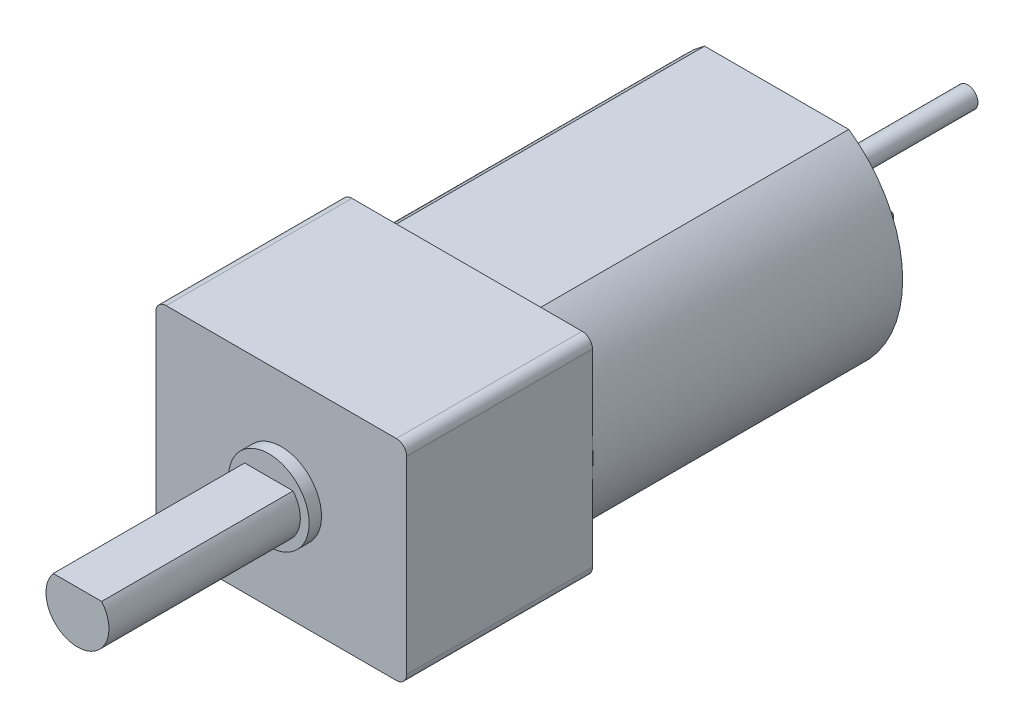
ISO-10303-21;
HEADER;
FILE_DESCRIPTION(('STEP AP214'),'2;1');
FILE_NAME('part.step','',(''),(''),'','','');
FILE_SCHEMA(('AUTOMOTIVE_DESIGN { 1 0 10303 214 1 1 1 1 }'));
ENDSEC;
DATA;
#1=APPLICATION_CONTEXT('core data for automotive mechanical design processes');
#2=APPLICATION_PROTOCOL_DEFINITION('international standard','automotive_design',2000,#1);
#3=PRODUCT_CONTEXT('',#1,'mechanical');
#4=PRODUCT('Part','Part','',(#3));
#5=PRODUCT_RELATED_PRODUCT_CATEGORY('part','',(#4));
#6=PRODUCT_DEFINITION_FORMATION('','',#4);
#7=PRODUCT_DEFINITION_CONTEXT('part definition',#1,'design');
#8=PRODUCT_DEFINITION('design','',#6,#7);
#9=PRODUCT_DEFINITION_SHAPE('','',#8);
#10=(LENGTH_UNIT() NAMED_UNIT(*) SI_UNIT(.MILLI.,.METRE.));
#11=(NAMED_UNIT(*) PLANE_ANGLE_UNIT() SI_UNIT($,.RADIAN.));
#12=(NAMED_UNIT(*) SI_UNIT($,.STERADIAN.) SOLID_ANGLE_UNIT());
#13=UNCERTAINTY_MEASURE_WITH_UNIT(LENGTH_MEASURE(1.E-05),#10,'distance_accuracy_value','');
#14=(GEOMETRIC_REPRESENTATION_CONTEXT(3) GLOBAL_UNCERTAINTY_ASSIGNED_CONTEXT((#13)) GLOBAL_UNIT_ASSIGNED_CONTEXT((#10,
#11,#12)) REPRESENTATION_CONTEXT('',''));
#15=CARTESIAN_POINT('',(0.,0.,0.));
#16=DIRECTION('',(0.,0.,1.));
#17=DIRECTION('',(1.,0.,0.));
#18=AXIS2_PLACEMENT_3D('',#15,#16,#17);
#19=CARTESIAN_POINT('',(0.,0.,-25.5));
#20=DIRECTION('',(0.,0.,-1.));
#21=DIRECTION('',(-1.,0.,0.));
#22=AXIS2_PLACEMENT_3D('',#19,#20,#21);
#23=PLANE('',#22);
#24=CARTESIAN_POINT('',(0.,0.,-25.5));
#25=DIRECTION('',(0.,0.,-1.));
#26=DIRECTION('',(-1.,0.,0.));
#27=AXIS2_PLACEMENT_3D('',#24,#25,#26);
#28=CIRCLE('',#27,2.2);
#29=CARTESIAN_POINT('',(-2.2,0.,-25.5));
#30=VERTEX_POINT('',#29);
#31=EDGE_CURVE('E41',#30,#30,#28,.T.);
#32=ORIENTED_EDGE('',*,*,#31,.T.);
#33=EDGE_LOOP('',(#32));
#34=FACE_BOUND('',#33,.T.);
#35=CARTESIAN_POINT('',(0.,0.,-25.5));
#36=DIRECTION('',(0.,0.,-1.));
#37=DIRECTION('',(-1.,0.,0.));
#38=AXIS2_PLACEMENT_3D('',#35,#36,#37);
#39=CIRCLE('',#38,0.5);
#40=CARTESIAN_POINT('',(-0.5,0.,-25.5));
#41=VERTEX_POINT('',#40);
#42=EDGE_CURVE('E771',#41,#41,#39,.T.);
#43=ORIENTED_EDGE('',*,*,#42,.F.);
#44=EDGE_LOOP('',(#43));
#45=FACE_BOUND('',#44,.T.);
#46=ADVANCED_FACE('F33',(#34,#45),#23,.T.);
#47=CARTESIAN_POINT('',(0.,0.,-24.));
#48=DIRECTION('',(0.,0.,-1.));
#49=DIRECTION('',(-1.,0.,0.));
#50=AXIS2_PLACEMENT_3D('',#47,#48,#49);
#51=PLANE('',#50);
#52=DIRECTION('',(0.,-1.,0.));
#53=VECTOR('',#52,1.);
#54=CARTESIAN_POINT('',(3.35,0.75,-24.));
#55=LINE('',#54,#53);
#56=CARTESIAN_POINT('',(3.35,0.75,-24.));
#57=VERTEX_POINT('',#56);
#58=CARTESIAN_POINT('',(3.35,-0.75,-24.));
#59=VERTEX_POINT('',#58);
#60=EDGE_CURVE('E225',#57,#59,#55,.T.);
#61=ORIENTED_EDGE('',*,*,#60,.T.);
#62=DIRECTION('',(1.,0.,0.));
#63=VECTOR('',#62,1.);
#64=CARTESIAN_POINT('',(3.35,-0.75,-24.));
#65=LINE('',#64,#63);
#66=CARTESIAN_POINT('',(3.65,-0.75,-24.));
#67=VERTEX_POINT('',#66);
#68=EDGE_CURVE('E241',#59,#67,#65,.T.);
#69=ORIENTED_EDGE('',*,*,#68,.T.);
#70=DIRECTION('',(0.,1.,0.));
#71=VECTOR('',#70,1.);
#72=CARTESIAN_POINT('',(3.65,0.75,-24.));
#73=LINE('',#72,#71);
#74=CARTESIAN_POINT('',(3.65,0.75,-24.));
#75=VERTEX_POINT('',#74);
#76=EDGE_CURVE('E250',#67,#75,#73,.T.);
#77=ORIENTED_EDGE('',*,*,#76,.T.);
#78=DIRECTION('',(-1.,0.,0.));
#79=VECTOR('',#78,1.);
#80=CARTESIAN_POINT('',(3.35,0.75,-24.));
#81=LINE('',#80,#79);
#82=EDGE_CURVE('E244',#75,#57,#81,.T.);
#83=ORIENTED_EDGE('',*,*,#82,.T.);
#84=EDGE_LOOP('',(#61,#69,#77,#83));
#85=FACE_BOUND('',#84,.T.);
#86=CARTESIAN_POINT('',(0.,0.,-24.));
#87=DIRECTION('',(0.,0.,-1.));
#88=DIRECTION('',(-1.,0.,0.));
#89=AXIS2_PLACEMENT_3D('',#86,#87,#88);
#90=CIRCLE('',#89,2.5);
#91=CARTESIAN_POINT('',(-2.5,0.,-24.));
#92=VERTEX_POINT('',#91);
#93=EDGE_CURVE('E287',#92,#92,#90,.T.);
#94=ORIENTED_EDGE('',*,*,#93,.F.);
#95=EDGE_LOOP('',(#94));
#96=FACE_BOUND('',#95,.T.);
#97=CARTESIAN_POINT('',(0.,0.,-24.));
#98=DIRECTION('',(0.,0.,-1.));
#99=DIRECTION('',(-1.,0.,0.));
#100=AXIS2_PLACEMENT_3D('',#97,#98,#99);
#101=CIRCLE('',#100,6.10000000000001);
#102=CARTESIAN_POINT('',(-3.49428104193124,-5.,-24.));
#103=VERTEX_POINT('',#102);
#104=CARTESIAN_POINT('',(-3.49428104193124,5.,-24.));
#105=VERTEX_POINT('',#104);
#106=EDGE_CURVE('E291',#103,#105,#101,.T.);
#107=ORIENTED_EDGE('',*,*,#106,.T.);
#108=DIRECTION('',(1.,0.,0.));
#109=VECTOR('',#108,1.);
#110=CARTESIAN_POINT('',(3.49428104193124,5.,-24.));
#111=LINE('',#110,#109);
#112=CARTESIAN_POINT('',(3.49428104193124,5.,-24.));
#113=VERTEX_POINT('',#112);
#114=EDGE_CURVE('E294',#105,#113,#111,.T.);
#115=ORIENTED_EDGE('',*,*,#114,.T.);
#116=CARTESIAN_POINT('',(0.,0.,-24.));
#117=DIRECTION('',(0.,0.,-1.));
#118=DIRECTION('',(-1.,0.,0.));
#119=AXIS2_PLACEMENT_3D('',#116,#117,#118);
#120=CIRCLE('',#119,6.10000000000001);
#121=CARTESIAN_POINT('',(3.49428104193124,-5.,-24.));
#122=VERTEX_POINT('',#121);
#123=EDGE_CURVE('E297',#113,#122,#120,.T.);
#124=ORIENTED_EDGE('',*,*,#123,.T.);
#125=DIRECTION('',(-1.,0.,0.));
#126=VECTOR('',#125,1.);
#127=CARTESIAN_POINT('',(3.49428104193124,-5.,-24.));
#128=LINE('',#127,#126);
#129=EDGE_CURVE('E299',#122,#103,#128,.T.);
#130=ORIENTED_EDGE('',*,*,#129,.T.);
#131=EDGE_LOOP('',(#107,#115,#124,#130));
#132=FACE_BOUND('',#131,.T.);
#133=DIRECTION('',(-1.,0.,0.));
#134=VECTOR('',#133,1.);
#135=CARTESIAN_POINT('',(-3.35,-0.75,-24.));
#136=LINE('',#135,#134);
#137=CARTESIAN_POINT('',(-3.35,-0.75,-24.));
#138=VERTEX_POINT('',#137);
#139=CARTESIAN_POINT('',(-3.65,-0.75,-24.));
#140=VERTEX_POINT('',#139);
#141=EDGE_CURVE('E272',#138,#140,#136,.T.);
#142=ORIENTED_EDGE('',*,*,#141,.F.);
#143=DIRECTION('',(0.,-1.,0.));
#144=VECTOR('',#143,1.);
#145=CARTESIAN_POINT('',(-3.35,0.75,-24.));
#146=LINE('',#145,#144);
#147=CARTESIAN_POINT('',(-3.35,0.75,-24.));
#148=VERTEX_POINT('',#147);
#149=EDGE_CURVE('E261',#148,#138,#146,.T.);
#150=ORIENTED_EDGE('',*,*,#149,.F.);
#151=DIRECTION('',(1.,0.,0.));
#152=VECTOR('',#151,1.);
#153=CARTESIAN_POINT('',(-3.35,0.75,-24.));
#154=LINE('',#153,#152);
#155=CARTESIAN_POINT('',(-3.65,0.75,-24.));
#156=VERTEX_POINT('',#155);
#157=EDGE_CURVE('E266',#156,#148,#154,.T.);
#158=ORIENTED_EDGE('',*,*,#157,.F.);
#159=DIRECTION('',(0.,1.,0.));
#160=VECTOR('',#159,1.);
#161=CARTESIAN_POINT('',(-3.65,0.75,-24.));
#162=LINE('',#161,#160);
#163=EDGE_CURVE('E275',#140,#156,#162,.T.);
#164=ORIENTED_EDGE('',*,*,#163,.F.);
#165=EDGE_LOOP('',(#142,#150,#158,#164));
#166=FACE_BOUND('',#165,.T.);
#167=ADVANCED_FACE('F238',(#85,#96,#132,#166),#51,.T.);
#168=CARTESIAN_POINT('',(-6.075,-5.075,-9.));
#169=DIRECTION('',(0.,0.,1.));
#170=DIRECTION('',(1.,0.,0.));
#171=AXIS2_PLACEMENT_3D('',#168,#169,#170);
#172=PLANE('',#171);
#173=DIRECTION('',(0.,1.,0.));
#174=VECTOR('',#173,1.);
#175=CARTESIAN_POINT('',(6.075,5.075,-9.));
#176=LINE('',#175,#174);
#177=CARTESIAN_POINT('',(6.075,-4.575,-9.));
#178=VERTEX_POINT('',#177);
#179=CARTESIAN_POINT('',(6.075,-0.551701912267932,-9.));
#180=VERTEX_POINT('',#179);
#181=EDGE_CURVE('E357',#178,#180,#176,.T.);
#182=ORIENTED_EDGE('',*,*,#181,.F.);
#183=CARTESIAN_POINT('',(5.575,-4.575,-9.));
#184=DIRECTION('',(0.,0.,1.));
#185=DIRECTION('',(1.,0.,0.));
#186=AXIS2_PLACEMENT_3D('',#183,#184,#185);
#187=CIRCLE('',#186,0.5);
#188=CARTESIAN_POINT('',(5.575,-5.075,-9.));
#189=VERTEX_POINT('',#188);
#190=EDGE_CURVE('E427',#178,#189,#187,.F.);
#191=ORIENTED_EDGE('',*,*,#190,.T.);
#192=DIRECTION('',(1.,0.,0.));
#193=VECTOR('',#192,1.);
#194=CARTESIAN_POINT('',(-6.075,-5.075,-9.));
#195=LINE('',#194,#193);
#196=CARTESIAN_POINT('',(-5.575,-5.075,-9.));
#197=VERTEX_POINT('',#196);
#198=EDGE_CURVE('E351',#197,#189,#195,.T.);
#199=ORIENTED_EDGE('',*,*,#198,.F.);
#200=CARTESIAN_POINT('',(-5.575,-4.575,-9.));
#201=DIRECTION('',(0.,0.,1.));
#202=DIRECTION('',(1.,0.,0.));
#203=AXIS2_PLACEMENT_3D('',#200,#201,#202);
#204=CIRCLE('',#203,0.5);
#205=CARTESIAN_POINT('',(-6.075,-4.575,-9.));
#206=VERTEX_POINT('',#205);
#207=EDGE_CURVE('E425',#197,#206,#204,.F.);
#208=ORIENTED_EDGE('',*,*,#207,.T.);
#209=DIRECTION('',(0.,-1.,0.));
#210=VECTOR('',#209,1.);
#211=CARTESIAN_POINT('',(-6.075,5.075,-9.));
#212=LINE('',#211,#210);
#213=CARTESIAN_POINT('',(-6.075,-0.551701912267932,-9.));
#214=VERTEX_POINT('',#213);
#215=EDGE_CURVE('E353',#214,#206,#212,.T.);
#216=ORIENTED_EDGE('',*,*,#215,.F.);
#217=CARTESIAN_POINT('',(0.,0.,-9.));
#218=DIRECTION('',(0.,0.,-1.));
#219=DIRECTION('',(-1.,0.,0.));
#220=AXIS2_PLACEMENT_3D('',#217,#218,#219);
#221=CIRCLE('',#220,6.10000000000001);
#222=CARTESIAN_POINT('',(-3.49428104193124,-5.,-9.));
#223=VERTEX_POINT('',#222);
#224=EDGE_CURVE('E302',#223,#214,#221,.T.);
#225=ORIENTED_EDGE('',*,*,#224,.F.);
#226=DIRECTION('',(-1.,0.,0.));
#227=VECTOR('',#226,1.);
#228=CARTESIAN_POINT('',(3.49428104193124,-5.,-9.));
#229=LINE('',#228,#227);
#230=CARTESIAN_POINT('',(3.49428104193124,-5.,-9.));
#231=VERTEX_POINT('',#230);
#232=EDGE_CURVE('E295',#231,#223,#229,.T.);
#233=ORIENTED_EDGE('',*,*,#232,.F.);
#234=CARTESIAN_POINT('',(0.,0.,-9.));
#235=DIRECTION('',(0.,0.,-1.));
#236=DIRECTION('',(-1.,0.,0.));
#237=AXIS2_PLACEMENT_3D('',#234,#235,#236);
#238=CIRCLE('',#237,6.10000000000001);
#239=EDGE_CURVE('E313',#180,#231,#238,.T.);
#240=ORIENTED_EDGE('',*,*,#239,.F.);
#241=EDGE_LOOP('',(#182,#191,#199,#208,#216,#225,#233,#240));
#242=FACE_BOUND('',#241,.T.);
#243=ADVANCED_FACE('F466',(#242),#172,.F.);
#244=CARTESIAN_POINT('',(-6.075,4.575,-9.));
#245=VERTEX_POINT('',#244);
#246=CARTESIAN_POINT('',(-6.075,0.551701912267932,-9.));
#247=VERTEX_POINT('',#246);
#248=EDGE_CURVE('E349',#245,#247,#212,.T.);
#249=ORIENTED_EDGE('',*,*,#248,.F.);
#250=CARTESIAN_POINT('',(-5.575,4.575,-9.));
#251=DIRECTION('',(0.,0.,1.));
#252=DIRECTION('',(1.,0.,0.));
#253=AXIS2_PLACEMENT_3D('',#250,#251,#252);
#254=CIRCLE('',#253,0.5);
#255=CARTESIAN_POINT('',(-5.575,5.075,-9.));
#256=VERTEX_POINT('',#255);
#257=EDGE_CURVE('E48',#245,#256,#254,.F.);
#258=ORIENTED_EDGE('',*,*,#257,.T.);
#259=DIRECTION('',(-1.,0.,0.));
#260=VECTOR('',#259,1.);
#261=CARTESIAN_POINT('',(-6.075,5.075,-9.));
#262=LINE('',#261,#260);
#263=CARTESIAN_POINT('',(5.575,5.075,-9.));
#264=VERTEX_POINT('',#263);
#265=EDGE_CURVE('E359',#264,#256,#262,.T.);
#266=ORIENTED_EDGE('',*,*,#265,.F.);
#267=CARTESIAN_POINT('',(5.575,4.575,-9.));
#268=DIRECTION('',(0.,0.,1.));
#269=DIRECTION('',(1.,0.,0.));
#270=AXIS2_PLACEMENT_3D('',#267,#268,#269);
#271=CIRCLE('',#270,0.5);
#272=CARTESIAN_POINT('',(6.075,4.575,-9.));
#273=VERTEX_POINT('',#272);
#274=EDGE_CURVE('E438',#264,#273,#271,.F.);
#275=ORIENTED_EDGE('',*,*,#274,.T.);
#276=CARTESIAN_POINT('',(6.075,0.551701912267932,-9.));
#277=VERTEX_POINT('',#276);
#278=EDGE_CURVE('E356',#277,#273,#176,.T.);
#279=ORIENTED_EDGE('',*,*,#278,.F.);
#280=CARTESIAN_POINT('',(3.49428104193124,5.,-9.));
#281=VERTEX_POINT('',#280);
#282=EDGE_CURVE('E310',#281,#277,#238,.T.);
#283=ORIENTED_EDGE('',*,*,#282,.F.);
#284=DIRECTION('',(1.,0.,0.));
#285=VECTOR('',#284,1.);
#286=CARTESIAN_POINT('',(3.49428104193124,5.,-9.));
#287=LINE('',#286,#285);
#288=CARTESIAN_POINT('',(-3.49428104193124,5.,-9.));
#289=VERTEX_POINT('',#288);
#290=EDGE_CURVE('E305',#289,#281,#287,.T.);
#291=ORIENTED_EDGE('',*,*,#290,.F.);
#292=EDGE_CURVE('E306',#247,#289,#221,.T.);
#293=ORIENTED_EDGE('',*,*,#292,.F.);
#294=EDGE_LOOP('',(#249,#258,#266,#275,#279,#283,#291,#293));
#295=FACE_BOUND('',#294,.T.);
#296=ADVANCED_FACE('F514',(#295),#172,.F.);
#297=CARTESIAN_POINT('',(0.,0.,0.6));
#298=DIRECTION('',(0.,0.,1.));
#299=DIRECTION('',(1.,0.,0.));
#300=AXIS2_PLACEMENT_3D('',#297,#298,#299);
#301=PLANE('',#300);
#302=CARTESIAN_POINT('',(0.,0.,0.6));
#303=DIRECTION('',(0.,0.,1.));
#304=DIRECTION('',(1.,0.,0.));
#305=AXIS2_PLACEMENT_3D('',#302,#303,#304);
#306=CIRCLE('',#305,1.95);
#307=CARTESIAN_POINT('',(1.95,0.,0.6));
#308=VERTEX_POINT('',#307);
#309=EDGE_CURVE('E343',#308,#308,#306,.T.);
#310=ORIENTED_EDGE('',*,*,#309,.T.);
#311=EDGE_LOOP('',(#310));
#312=FACE_BOUND('',#311,.T.);
#313=DIRECTION('',(-1.,0.,0.));
#314=VECTOR('',#313,1.);
#315=CARTESIAN_POINT('',(-1.17260393995586,0.975000000000002,0.6));
#316=LINE('',#315,#314);
#317=CARTESIAN_POINT('',(1.17260393995586,0.975000000000002,0.6));
#318=VERTEX_POINT('',#317);
#319=CARTESIAN_POINT('',(-1.17260393995586,0.975000000000002,0.6));
#320=VERTEX_POINT('',#319);
#321=EDGE_CURVE('E332',#318,#320,#316,.T.);
#322=ORIENTED_EDGE('',*,*,#321,.F.);
#323=CARTESIAN_POINT('',(0.,0.,0.6));
#324=DIRECTION('',(0.,0.,1.));
#325=DIRECTION('',(1.,0.,0.));
#326=AXIS2_PLACEMENT_3D('',#323,#324,#325);
#327=CIRCLE('',#326,1.525);
#328=EDGE_CURVE('E327',#320,#318,#327,.T.);
#329=ORIENTED_EDGE('',*,*,#328,.F.);
#330=EDGE_LOOP('',(#322,#329));
#331=FACE_BOUND('',#330,.T.);
#332=ADVANCED_FACE('F510',(#312,#331),#301,.T.);
#333=CARTESIAN_POINT('',(-6.075,-5.075,0.));
#334=DIRECTION('',(0.,0.,1.));
#335=DIRECTION('',(1.,0.,0.));
#336=AXIS2_PLACEMENT_3D('',#333,#334,#335);
#337=PLANE('',#336);
#338=DIRECTION('',(1.,0.,0.));
#339=VECTOR('',#338,1.);
#340=CARTESIAN_POINT('',(-6.075,-5.075,0.));
#341=LINE('',#340,#339);
#342=CARTESIAN_POINT('',(-5.575,-5.075,0.));
#343=VERTEX_POINT('',#342);
#344=CARTESIAN_POINT('',(5.575,-5.075,0.));
#345=VERTEX_POINT('',#344);
#346=EDGE_CURVE('E364',#343,#345,#341,.T.);
#347=ORIENTED_EDGE('',*,*,#346,.T.);
#348=CARTESIAN_POINT('',(5.575,-4.575,0.));
#349=DIRECTION('',(0.,0.,1.));
#350=DIRECTION('',(1.,0.,0.));
#351=AXIS2_PLACEMENT_3D('',#348,#349,#350);
#352=CIRCLE('',#351,0.5);
#353=CARTESIAN_POINT('',(6.075,-4.575,0.));
#354=VERTEX_POINT('',#353);
#355=EDGE_CURVE('E418',#345,#354,#352,.T.);
#356=ORIENTED_EDGE('',*,*,#355,.T.);
#357=DIRECTION('',(0.,1.,0.));
#358=VECTOR('',#357,1.);
#359=CARTESIAN_POINT('',(6.075,5.075,0.));
#360=LINE('',#359,#358);
#361=CARTESIAN_POINT('',(6.075,4.575,0.));
#362=VERTEX_POINT('',#361);
#363=EDGE_CURVE('E367',#354,#362,#360,.T.);
#364=ORIENTED_EDGE('',*,*,#363,.T.);
#365=CARTESIAN_POINT('',(5.575,4.575,0.));
#366=DIRECTION('',(0.,0.,1.));
#367=DIRECTION('',(1.,0.,0.));
#368=AXIS2_PLACEMENT_3D('',#365,#366,#367);
#369=CIRCLE('',#368,0.5);
#370=CARTESIAN_POINT('',(5.575,5.075,0.));
#371=VERTEX_POINT('',#370);
#372=EDGE_CURVE('E412',#362,#371,#369,.T.);
#373=ORIENTED_EDGE('',*,*,#372,.T.);
#374=DIRECTION('',(-1.,0.,0.));
#375=VECTOR('',#374,1.);
#376=CARTESIAN_POINT('',(-6.075,5.075,0.));
#377=LINE('',#376,#375);
#378=CARTESIAN_POINT('',(-5.575,5.075,0.));
#379=VERTEX_POINT('',#378);
#380=EDGE_CURVE('E370',#371,#379,#377,.T.);
#381=ORIENTED_EDGE('',*,*,#380,.T.);
#382=CARTESIAN_POINT('',(-5.575,4.575,0.));
#383=DIRECTION('',(0.,0.,1.));
#384=DIRECTION('',(1.,0.,0.));
#385=AXIS2_PLACEMENT_3D('',#382,#383,#384);
#386=CIRCLE('',#385,0.5);
#387=CARTESIAN_POINT('',(-6.075,4.575,0.));
#388=VERTEX_POINT('',#387);
#389=EDGE_CURVE('E414',#379,#388,#386,.T.);
#390=ORIENTED_EDGE('',*,*,#389,.T.);
#391=DIRECTION('',(0.,-1.,0.));
#392=VECTOR('',#391,1.);
#393=CARTESIAN_POINT('',(-6.075,5.075,0.));
#394=LINE('',#393,#392);
#395=CARTESIAN_POINT('',(-6.075,-4.575,0.));
#396=VERTEX_POINT('',#395);
#397=EDGE_CURVE('E346',#388,#396,#394,.T.);
#398=ORIENTED_EDGE('',*,*,#397,.T.);
#399=CARTESIAN_POINT('',(-5.575,-4.575,0.));
#400=DIRECTION('',(0.,0.,1.));
#401=DIRECTION('',(1.,0.,0.));
#402=AXIS2_PLACEMENT_3D('',#399,#400,#401);
#403=CIRCLE('',#402,0.5);
#404=EDGE_CURVE('E416',#396,#343,#403,.T.);
#405=ORIENTED_EDGE('',*,*,#404,.T.);
#406=EDGE_LOOP('',(#347,#356,#364,#373,#381,#390,#398,#405));
#407=FACE_BOUND('',#406,.T.);
#408=CARTESIAN_POINT('',(0.,0.,0.));
#409=DIRECTION('',(0.,0.,1.));
#410=DIRECTION('',(1.,0.,0.));
#411=AXIS2_PLACEMENT_3D('',#408,#409,#410);
#412=CIRCLE('',#411,1.95);
#413=CARTESIAN_POINT('',(1.95,0.,0.));
#414=VERTEX_POINT('',#413);
#415=EDGE_CURVE('E342',#414,#414,#412,.T.);
#416=ORIENTED_EDGE('',*,*,#415,.F.);
#417=EDGE_LOOP('',(#416));
#418=FACE_BOUND('',#417,.T.);
#419=ADVANCED_FACE('F513',(#407,#418),#337,.T.);
#420=CARTESIAN_POINT('',(-6.075,5.075,-9.));
#421=DIRECTION('',(-1.,0.,0.));
#422=DIRECTION('',(0.,0.,1.));
#423=AXIS2_PLACEMENT_3D('',#420,#421,#422);
#424=PLANE('',#423);
#425=ORIENTED_EDGE('',*,*,#215,.T.);
#426=DIRECTION('',(0.,0.,1.));
#427=VECTOR('',#426,1.);
#428=CARTESIAN_POINT('',(-6.075,-4.575,-9.));
#429=LINE('',#428,#427);
#430=EDGE_CURVE('E431',#206,#396,#429,.T.);
#431=ORIENTED_EDGE('',*,*,#430,.T.);
#432=ORIENTED_EDGE('',*,*,#397,.F.);
#433=DIRECTION('',(0.,0.,1.));
#434=VECTOR('',#433,1.);
#435=CARTESIAN_POINT('',(-6.075,4.575,-9.));
#436=LINE('',#435,#434);
#437=EDGE_CURVE('E429',#388,#245,#436,.F.);
#438=ORIENTED_EDGE('',*,*,#437,.T.);
#439=ORIENTED_EDGE('',*,*,#248,.T.);
#440=EDGE_CURVE('E352',#247,#214,#212,.T.);
#441=ORIENTED_EDGE('',*,*,#440,.T.);
#442=EDGE_LOOP('',(#425,#431,#432,#438,#439,#441));
#443=FACE_BOUND('',#442,.T.);
#444=ADVANCED_FACE('F525',(#443),#424,.T.);
#445=CARTESIAN_POINT('',(-6.075,5.075,-9.));
#446=DIRECTION('',(0.,1.,0.));
#447=DIRECTION('',(0.,0.,1.));
#448=AXIS2_PLACEMENT_3D('',#445,#446,#447);
#449=PLANE('',#448);
#450=ORIENTED_EDGE('',*,*,#265,.T.);
#451=DIRECTION('',(0.,0.,1.));
#452=VECTOR('',#451,1.);
#453=CARTESIAN_POINT('',(-5.575,5.075,-9.));
#454=LINE('',#453,#452);
#455=EDGE_CURVE('E435',#256,#379,#454,.T.);
#456=ORIENTED_EDGE('',*,*,#455,.T.);
#457=ORIENTED_EDGE('',*,*,#380,.F.);
#458=DIRECTION('',(0.,0.,1.));
#459=VECTOR('',#458,1.);
#460=CARTESIAN_POINT('',(5.575,5.075,-9.));
#461=LINE('',#460,#459);
#462=EDGE_CURVE('E55',#371,#264,#461,.F.);
#463=ORIENTED_EDGE('',*,*,#462,.T.);
#464=EDGE_LOOP('',(#450,#456,#457,#463));
#465=FACE_BOUND('',#464,.T.);
#466=ADVANCED_FACE('F527',(#465),#449,.T.);
#467=CARTESIAN_POINT('',(6.075,5.075,-9.));
#468=DIRECTION('',(1.,0.,0.));
#469=DIRECTION('',(0.,0.,-1.));
#470=AXIS2_PLACEMENT_3D('',#467,#468,#469);
#471=PLANE('',#470);
#472=ORIENTED_EDGE('',*,*,#363,.F.);
#473=DIRECTION('',(0.,0.,1.));
#474=VECTOR('',#473,1.);
#475=CARTESIAN_POINT('',(6.075,-4.575,-9.));
#476=LINE('',#475,#474);
#477=EDGE_CURVE('E423',#354,#178,#476,.F.);
#478=ORIENTED_EDGE('',*,*,#477,.T.);
#479=ORIENTED_EDGE('',*,*,#181,.T.);
#480=EDGE_CURVE('E360',#180,#277,#176,.T.);
#481=ORIENTED_EDGE('',*,*,#480,.T.);
#482=ORIENTED_EDGE('',*,*,#278,.T.);
#483=DIRECTION('',(0.,0.,1.));
#484=VECTOR('',#483,1.);
#485=CARTESIAN_POINT('',(6.075,4.575,-9.));
#486=LINE('',#485,#484);
#487=EDGE_CURVE('E420',#273,#362,#486,.T.);
#488=ORIENTED_EDGE('',*,*,#487,.T.);
#489=EDGE_LOOP('',(#472,#478,#479,#481,#482,#488));
#490=FACE_BOUND('',#489,.T.);
#491=ADVANCED_FACE('F530',(#490),#471,.T.);
#492=CARTESIAN_POINT('',(-6.075,-5.075,-9.));
#493=DIRECTION('',(0.,-1.,0.));
#494=DIRECTION('',(0.,0.,-1.));
#495=AXIS2_PLACEMENT_3D('',#492,#493,#494);
#496=PLANE('',#495);
#497=ORIENTED_EDGE('',*,*,#198,.T.);
#498=DIRECTION('',(0.,0.,1.));
#499=VECTOR('',#498,1.);
#500=CARTESIAN_POINT('',(5.575,-5.075,-9.));
#501=LINE('',#500,#499);
#502=EDGE_CURVE('E409',#189,#345,#501,.T.);
#503=ORIENTED_EDGE('',*,*,#502,.T.);
#504=ORIENTED_EDGE('',*,*,#346,.F.);
#505=DIRECTION('',(0.,0.,1.));
#506=VECTOR('',#505,1.);
#507=CARTESIAN_POINT('',(-5.575,-5.075,-9.));
#508=LINE('',#507,#506);
#509=EDGE_CURVE('E407',#343,#197,#508,.F.);
#510=ORIENTED_EDGE('',*,*,#509,.T.);
#511=EDGE_LOOP('',(#497,#503,#504,#510));
#512=FACE_BOUND('',#511,.T.);
#513=ADVANCED_FACE('F518',(#512),#496,.T.);
#514=CARTESIAN_POINT('',(0.,0.,0.6));
#515=DIRECTION('',(0.,0.,-1.));
#516=DIRECTION('',(-1.,0.,0.));
#517=AXIS2_PLACEMENT_3D('',#514,#515,#516);
#518=CYLINDRICAL_SURFACE('',#517,1.95);
#519=ORIENTED_EDGE('',*,*,#309,.F.);
#520=EDGE_LOOP('',(#519));
#521=FACE_BOUND('',#520,.T.);
#522=ORIENTED_EDGE('',*,*,#415,.T.);
#523=EDGE_LOOP('',(#522));
#524=FACE_BOUND('',#523,.T.);
#525=ADVANCED_FACE('F508',(#521,#524),#518,.T.);
#526=CARTESIAN_POINT('',(0.,0.,9.87));
#527=DIRECTION('',(0.,0.,-1.));
#528=DIRECTION('',(-1.,0.,0.));
#529=AXIS2_PLACEMENT_3D('',#526,#527,#528);
#530=CYLINDRICAL_SURFACE('',#529,1.525);
#531=ORIENTED_EDGE('',*,*,#328,.T.);
#532=DIRECTION('',(0.,0.,-1.));
#533=VECTOR('',#532,1.);
#534=CARTESIAN_POINT('',(1.17260393995586,0.975000000000002,9.87));
#535=LINE('',#534,#533);
#536=CARTESIAN_POINT('',(1.17260393995586,0.975000000000002,9.87));
#537=VERTEX_POINT('',#536);
#538=EDGE_CURVE('E339',#537,#318,#535,.T.);
#539=ORIENTED_EDGE('',*,*,#538,.F.);
#540=CARTESIAN_POINT('',(0.,0.,9.87));
#541=DIRECTION('',(0.,0.,1.));
#542=DIRECTION('',(1.,0.,0.));
#543=AXIS2_PLACEMENT_3D('',#540,#541,#542);
#544=CIRCLE('',#543,1.525);
#545=CARTESIAN_POINT('',(-1.17260393995586,0.975000000000002,9.87));
#546=VERTEX_POINT('',#545);
#547=EDGE_CURVE('E328',#546,#537,#544,.T.);
#548=ORIENTED_EDGE('',*,*,#547,.F.);
#549=DIRECTION('',(0.,0.,-1.));
#550=VECTOR('',#549,1.);
#551=CARTESIAN_POINT('',(-1.17260393995586,0.975000000000002,9.87));
#552=LINE('',#551,#550);
#553=EDGE_CURVE('E334',#546,#320,#552,.T.);
#554=ORIENTED_EDGE('',*,*,#553,.T.);
#555=EDGE_LOOP('',(#531,#539,#548,#554));
#556=FACE_BOUND('',#555,.T.);
#557=ADVANCED_FACE('F504',(#556),#530,.T.);
#558=CARTESIAN_POINT('',(-1.17260393995586,0.975000000000002,9.87));
#559=DIRECTION('',(0.,-1.,0.));
#560=DIRECTION('',(1.,0.,0.));
#561=AXIS2_PLACEMENT_3D('',#558,#559,#560);
#562=PLANE('',#561);
#563=ORIENTED_EDGE('',*,*,#321,.T.);
#564=ORIENTED_EDGE('',*,*,#553,.F.);
#565=DIRECTION('',(-1.,0.,0.));
#566=VECTOR('',#565,1.);
#567=CARTESIAN_POINT('',(-1.17260393995586,0.975000000000002,9.87));
#568=LINE('',#567,#566);
#569=EDGE_CURVE('E331',#537,#546,#568,.T.);
#570=ORIENTED_EDGE('',*,*,#569,.F.);
#571=ORIENTED_EDGE('',*,*,#538,.T.);
#572=EDGE_LOOP('',(#563,#564,#570,#571));
#573=FACE_BOUND('',#572,.T.);
#574=ADVANCED_FACE('F500',(#573),#562,.F.);
#575=CARTESIAN_POINT('',(0.,0.,9.87));
#576=DIRECTION('',(0.,0.,1.));
#577=DIRECTION('',(1.,0.,0.));
#578=AXIS2_PLACEMENT_3D('',#575,#576,#577);
#579=PLANE('',#578);
#580=ORIENTED_EDGE('',*,*,#547,.T.);
#581=ORIENTED_EDGE('',*,*,#569,.T.);
#582=EDGE_LOOP('',(#580,#581));
#583=FACE_BOUND('',#582,.T.);
#584=ADVANCED_FACE('F497',(#583),#579,.T.);
#585=CARTESIAN_POINT('',(0.,0.,-9.));
#586=DIRECTION('',(0.,0.,-1.));
#587=DIRECTION('',(-1.,0.,0.));
#588=AXIS2_PLACEMENT_3D('',#585,#586,#587);
#589=PLANE('',#588);
#590=ORIENTED_EDGE('',*,*,#440,.F.);
#591=EDGE_CURVE('E290',#214,#247,#221,.T.);
#592=ORIENTED_EDGE('',*,*,#591,.F.);
#593=EDGE_LOOP('',(#590,#592));
#594=FACE_BOUND('',#593,.T.);
#595=ADVANCED_FACE('F481',(#594),#589,.F.);
#596=CARTESIAN_POINT('',(0.,0.,-24.));
#597=DIRECTION('',(0.,0.,1.));
#598=DIRECTION('',(1.,0.,0.));
#599=AXIS2_PLACEMENT_3D('',#596,#597,#598);
#600=CYLINDRICAL_SURFACE('',#599,6.10000000000001);
#601=ORIENTED_EDGE('',*,*,#224,.T.);
#602=ORIENTED_EDGE('',*,*,#591,.T.);
#603=ORIENTED_EDGE('',*,*,#292,.T.);
#604=DIRECTION('',(0.,0.,1.));
#605=VECTOR('',#604,1.);
#606=CARTESIAN_POINT('',(-3.49428104193124,5.,-24.));
#607=LINE('',#606,#605);
#608=EDGE_CURVE('E324',#105,#289,#607,.T.);
#609=ORIENTED_EDGE('',*,*,#608,.F.);
#610=ORIENTED_EDGE('',*,*,#106,.F.);
#611=DIRECTION('',(0.,0.,1.));
#612=VECTOR('',#611,1.);
#613=CARTESIAN_POINT('',(-3.49428104193124,-5.,-24.));
#614=LINE('',#613,#612);
#615=EDGE_CURVE('E301',#103,#223,#614,.T.);
#616=ORIENTED_EDGE('',*,*,#615,.T.);
#617=EDGE_LOOP('',(#601,#602,#603,#609,#610,#616));
#618=FACE_BOUND('',#617,.T.);
#619=ADVANCED_FACE('F492',(#618),#600,.T.);
#620=CARTESIAN_POINT('',(3.49428104193124,5.,-24.));
#621=DIRECTION('',(0.,-1.,0.));
#622=DIRECTION('',(0.,0.,-1.));
#623=AXIS2_PLACEMENT_3D('',#620,#621,#622);
#624=PLANE('',#623);
#625=ORIENTED_EDGE('',*,*,#290,.T.);
#626=DIRECTION('',(0.,0.,1.));
#627=VECTOR('',#626,1.);
#628=CARTESIAN_POINT('',(3.49428104193124,5.,-24.));
#629=LINE('',#628,#627);
#630=EDGE_CURVE('E321',#113,#281,#629,.T.);
#631=ORIENTED_EDGE('',*,*,#630,.F.);
#632=ORIENTED_EDGE('',*,*,#114,.F.);
#633=ORIENTED_EDGE('',*,*,#608,.T.);
#634=EDGE_LOOP('',(#625,#631,#632,#633));
#635=FACE_BOUND('',#634,.T.);
#636=ADVANCED_FACE('F488',(#635),#624,.F.);
#637=CARTESIAN_POINT('',(0.,0.,-24.));
#638=DIRECTION('',(0.,0.,1.));
#639=DIRECTION('',(1.,0.,0.));
#640=AXIS2_PLACEMENT_3D('',#637,#638,#639);
#641=CYLINDRICAL_SURFACE('',#640,6.10000000000001);
#642=ORIENTED_EDGE('',*,*,#282,.T.);
#643=EDGE_CURVE('E309',#277,#180,#238,.T.);
#644=ORIENTED_EDGE('',*,*,#643,.T.);
#645=ORIENTED_EDGE('',*,*,#239,.T.);
#646=DIRECTION('',(0.,0.,1.));
#647=VECTOR('',#646,1.);
#648=CARTESIAN_POINT('',(3.49428104193124,-5.,-24.));
#649=LINE('',#648,#647);
#650=EDGE_CURVE('E318',#122,#231,#649,.T.);
#651=ORIENTED_EDGE('',*,*,#650,.F.);
#652=ORIENTED_EDGE('',*,*,#123,.F.);
#653=ORIENTED_EDGE('',*,*,#630,.T.);
#654=EDGE_LOOP('',(#642,#644,#645,#651,#652,#653));
#655=FACE_BOUND('',#654,.T.);
#656=ADVANCED_FACE('F484',(#655),#641,.T.);
#657=CARTESIAN_POINT('',(3.49428104193124,-5.,-24.));
#658=DIRECTION('',(0.,1.,0.));
#659=DIRECTION('',(0.,0.,1.));
#660=AXIS2_PLACEMENT_3D('',#657,#658,#659);
#661=PLANE('',#660);
#662=ORIENTED_EDGE('',*,*,#232,.T.);
#663=ORIENTED_EDGE('',*,*,#615,.F.);
#664=ORIENTED_EDGE('',*,*,#129,.F.);
#665=ORIENTED_EDGE('',*,*,#650,.T.);
#666=EDGE_LOOP('',(#662,#663,#664,#665));
#667=FACE_BOUND('',#666,.T.);
#668=ADVANCED_FACE('F479',(#667),#661,.F.);
#669=ORIENTED_EDGE('',*,*,#480,.F.);
#670=ORIENTED_EDGE('',*,*,#643,.F.);
#671=EDGE_LOOP('',(#669,#670));
#672=FACE_BOUND('',#671,.T.);
#673=ADVANCED_FACE('F474',(#672),#589,.F.);
#674=CARTESIAN_POINT('',(0.,0.,-25.5));
#675=DIRECTION('',(0.,0.,1.));
#676=DIRECTION('',(1.,0.,0.));
#677=AXIS2_PLACEMENT_3D('',#674,#675,#676);
#678=CYLINDRICAL_SURFACE('',#677,2.5);
#679=CARTESIAN_POINT('',(0.,0.,-25.2));
#680=DIRECTION('',(0.,0.,-1.));
#681=DIRECTION('',(-1.,0.,0.));
#682=AXIS2_PLACEMENT_3D('',#679,#680,#681);
#683=CIRCLE('',#682,2.5);
#684=CARTESIAN_POINT('',(-2.5,0.,-25.2));
#685=VERTEX_POINT('',#684);
#686=EDGE_CURVE('E11',#685,#685,#683,.F.);
#687=ORIENTED_EDGE('',*,*,#686,.T.);
#688=EDGE_LOOP('',(#687));
#689=FACE_BOUND('',#688,.T.);
#690=ORIENTED_EDGE('',*,*,#93,.T.);
#691=EDGE_LOOP('',(#690));
#692=FACE_BOUND('',#691,.T.);
#693=ADVANCED_FACE('F472',(#689,#692),#678,.T.);
#694=CARTESIAN_POINT('',(-3.35,0.75,-26.));
#695=DIRECTION('',(-1.,0.,0.));
#696=DIRECTION('',(0.,0.,1.));
#697=AXIS2_PLACEMENT_3D('',#694,#695,#696);
#698=PLANE('',#697);
#699=DIRECTION('',(0.,0.,1.));
#700=VECTOR('',#699,1.);
#701=CARTESIAN_POINT('',(-3.35,-0.75,-26.));
#702=LINE('',#701,#700);
#703=CARTESIAN_POINT('',(-3.35,-0.75,-25.7));
#704=VERTEX_POINT('',#703);
#705=EDGE_CURVE('E285',#704,#138,#702,.T.);
#706=ORIENTED_EDGE('',*,*,#705,.F.);
#707=CARTESIAN_POINT('',(-3.35,-0.45,-25.7));
#708=DIRECTION('',(-1.,0.,0.));
#709=DIRECTION('',(0.,0.,1.));
#710=AXIS2_PLACEMENT_3D('',#707,#708,#709);
#711=CIRCLE('',#710,0.3);
#712=CARTESIAN_POINT('',(-3.35,-0.45,-26.));
#713=VERTEX_POINT('',#712);
#714=EDGE_CURVE('E387',#704,#713,#711,.F.);
#715=ORIENTED_EDGE('',*,*,#714,.T.);
#716=DIRECTION('',(0.,-1.,0.));
#717=VECTOR('',#716,1.);
#718=CARTESIAN_POINT('',(-3.35,0.75,-26.));
#719=LINE('',#718,#717);
#720=CARTESIAN_POINT('',(-3.35,0.45,-26.));
#721=VERTEX_POINT('',#720);
#722=EDGE_CURVE('E262',#721,#713,#719,.T.);
#723=ORIENTED_EDGE('',*,*,#722,.F.);
#724=CARTESIAN_POINT('',(-3.35,0.45,-25.7));
#725=DIRECTION('',(-1.,0.,0.));
#726=DIRECTION('',(0.,0.,1.));
#727=AXIS2_PLACEMENT_3D('',#724,#725,#726);
#728=CIRCLE('',#727,0.3);
#729=CARTESIAN_POINT('',(-3.35,0.75,-25.7));
#730=VERTEX_POINT('',#729);
#731=EDGE_CURVE('E385',#721,#730,#728,.F.);
#732=ORIENTED_EDGE('',*,*,#731,.T.);
#733=DIRECTION('',(0.,0.,1.));
#734=VECTOR('',#733,1.);
#735=CARTESIAN_POINT('',(-3.35,0.75,-26.));
#736=LINE('',#735,#734);
#737=EDGE_CURVE('E269',#730,#148,#736,.T.);
#738=ORIENTED_EDGE('',*,*,#737,.T.);
#739=ORIENTED_EDGE('',*,*,#149,.T.);
#740=EDGE_LOOP('',(#706,#715,#723,#732,#738,#739));
#741=FACE_BOUND('',#740,.T.);
#742=ADVANCED_FACE('F470',(#741),#698,.F.);
#743=CARTESIAN_POINT('',(-3.35,-0.75,-26.));
#744=DIRECTION('',(0.,1.,0.));
#745=DIRECTION('',(-1.,0.,0.));
#746=AXIS2_PLACEMENT_3D('',#743,#744,#745);
#747=PLANE('',#746);
#748=DIRECTION('',(0.,0.,1.));
#749=VECTOR('',#748,1.);
#750=CARTESIAN_POINT('',(-3.65,-0.75,-26.));
#751=LINE('',#750,#749);
#752=CARTESIAN_POINT('',(-3.65,-0.75,-25.7));
#753=VERTEX_POINT('',#752);
#754=EDGE_CURVE('E283',#753,#140,#751,.T.);
#755=ORIENTED_EDGE('',*,*,#754,.F.);
#756=DIRECTION('',(-1.,0.,0.));
#757=VECTOR('',#756,1.);
#758=CARTESIAN_POINT('',(-3.35,-0.75,-25.7));
#759=LINE('',#758,#757);
#760=EDGE_CURVE('E383',#753,#704,#759,.F.);
#761=ORIENTED_EDGE('',*,*,#760,.T.);
#762=ORIENTED_EDGE('',*,*,#705,.T.);
#763=ORIENTED_EDGE('',*,*,#141,.T.);
#764=EDGE_LOOP('',(#755,#761,#762,#763));
#765=FACE_BOUND('',#764,.T.);
#766=ADVANCED_FACE('F645',(#765),#747,.F.);
#767=CARTESIAN_POINT('',(-3.65,0.75,-26.));
#768=DIRECTION('',(1.,0.,0.));
#769=DIRECTION('',(0.,0.,-1.));
#770=AXIS2_PLACEMENT_3D('',#767,#768,#769);
#771=PLANE('',#770);
#772=DIRECTION('',(0.,1.,0.));
#773=VECTOR('',#772,1.);
#774=CARTESIAN_POINT('',(-3.65,0.75,-26.));
#775=LINE('',#774,#773);
#776=CARTESIAN_POINT('',(-3.65,-0.45,-26.));
#777=VERTEX_POINT('',#776);
#778=CARTESIAN_POINT('',(-3.65,0.45,-26.));
#779=VERTEX_POINT('',#778);
#780=EDGE_CURVE('E265',#777,#779,#775,.T.);
#781=ORIENTED_EDGE('',*,*,#780,.F.);
#782=CARTESIAN_POINT('',(-3.65,-0.45,-25.7));
#783=DIRECTION('',(1.,0.,0.));
#784=DIRECTION('',(0.,0.,-1.));
#785=AXIS2_PLACEMENT_3D('',#782,#783,#784);
#786=CIRCLE('',#785,0.3);
#787=EDGE_CURVE('E381',#777,#753,#786,.F.);
#788=ORIENTED_EDGE('',*,*,#787,.T.);
#789=ORIENTED_EDGE('',*,*,#754,.T.);
#790=ORIENTED_EDGE('',*,*,#163,.T.);
#791=DIRECTION('',(0.,0.,1.));
#792=VECTOR('',#791,1.);
#793=CARTESIAN_POINT('',(-3.65,0.75,-26.));
#794=LINE('',#793,#792);
#795=CARTESIAN_POINT('',(-3.65,0.75,-25.7));
#796=VERTEX_POINT('',#795);
#797=EDGE_CURVE('E281',#796,#156,#794,.T.);
#798=ORIENTED_EDGE('',*,*,#797,.F.);
#799=CARTESIAN_POINT('',(-3.65,0.45,-25.7));
#800=DIRECTION('',(1.,0.,0.));
#801=DIRECTION('',(0.,0.,-1.));
#802=AXIS2_PLACEMENT_3D('',#799,#800,#801);
#803=CIRCLE('',#802,0.3);
#804=EDGE_CURVE('E379',#796,#779,#803,.F.);
#805=ORIENTED_EDGE('',*,*,#804,.T.);
#806=EDGE_LOOP('',(#781,#788,#789,#790,#798,#805));
#807=FACE_BOUND('',#806,.T.);
#808=ADVANCED_FACE('F652',(#807),#771,.F.);
#809=CARTESIAN_POINT('',(-3.35,0.75,-26.));
#810=DIRECTION('',(0.,-1.,0.));
#811=DIRECTION('',(1.,0.,0.));
#812=AXIS2_PLACEMENT_3D('',#809,#810,#811);
#813=PLANE('',#812);
#814=ORIENTED_EDGE('',*,*,#737,.F.);
#815=DIRECTION('',(1.,0.,0.));
#816=VECTOR('',#815,1.);
#817=CARTESIAN_POINT('',(-3.65,0.75,-25.7));
#818=LINE('',#817,#816);
#819=EDGE_CURVE('E389',#730,#796,#818,.F.);
#820=ORIENTED_EDGE('',*,*,#819,.T.);
#821=ORIENTED_EDGE('',*,*,#797,.T.);
#822=ORIENTED_EDGE('',*,*,#157,.T.);
#823=EDGE_LOOP('',(#814,#820,#821,#822));
#824=FACE_BOUND('',#823,.T.);
#825=ADVANCED_FACE('F659',(#824),#813,.F.);
#826=CARTESIAN_POINT('',(-3.35,-0.75,-26.));
#827=DIRECTION('',(0.,0.,-1.));
#828=DIRECTION('',(-1.,0.,0.));
#829=AXIS2_PLACEMENT_3D('',#826,#827,#828);
#830=PLANE('',#829);
#831=ORIENTED_EDGE('',*,*,#722,.T.);
#832=DIRECTION('',(-1.,0.,0.));
#833=VECTOR('',#832,1.);
#834=CARTESIAN_POINT('',(-3.65,-0.45,-26.));
#835=LINE('',#834,#833);
#836=EDGE_CURVE('E376',#713,#777,#835,.T.);
#837=ORIENTED_EDGE('',*,*,#836,.T.);
#838=ORIENTED_EDGE('',*,*,#780,.T.);
#839=DIRECTION('',(1.,0.,0.));
#840=VECTOR('',#839,1.);
#841=CARTESIAN_POINT('',(-3.35,0.45,-26.));
#842=LINE('',#841,#840);
#843=EDGE_CURVE('E373',#779,#721,#842,.T.);
#844=ORIENTED_EDGE('',*,*,#843,.T.);
#845=EDGE_LOOP('',(#831,#837,#838,#844));
#846=FACE_BOUND('',#845,.T.);
#847=ADVANCED_FACE('F544',(#846),#830,.T.);
#848=CARTESIAN_POINT('',(-3.35,-0.45,-25.7));
#849=DIRECTION('',(1.,0.,0.));
#850=DIRECTION('',(0.,1.,0.));
#851=AXIS2_PLACEMENT_3D('',#848,#849,#850);
#852=CYLINDRICAL_SURFACE('',#851,0.3);
#853=ORIENTED_EDGE('',*,*,#714,.F.);
#854=ORIENTED_EDGE('',*,*,#760,.F.);
#855=ORIENTED_EDGE('',*,*,#787,.F.);
#856=ORIENTED_EDGE('',*,*,#836,.F.);
#857=EDGE_LOOP('',(#853,#854,#855,#856));
#858=FACE_BOUND('',#857,.T.);
#859=ADVANCED_FACE('F540',(#858),#852,.T.);
#860=CARTESIAN_POINT('',(-3.35,0.45,-25.7));
#861=DIRECTION('',(-1.,0.,0.));
#862=DIRECTION('',(0.,-1.,0.));
#863=AXIS2_PLACEMENT_3D('',#860,#861,#862);
#864=CYLINDRICAL_SURFACE('',#863,0.3);
#865=ORIENTED_EDGE('',*,*,#804,.F.);
#866=ORIENTED_EDGE('',*,*,#819,.F.);
#867=ORIENTED_EDGE('',*,*,#731,.F.);
#868=ORIENTED_EDGE('',*,*,#843,.F.);
#869=EDGE_LOOP('',(#865,#866,#867,#868));
#870=FACE_BOUND('',#869,.T.);
#871=ADVANCED_FACE('F543',(#870),#864,.T.);
#872=CARTESIAN_POINT('',(3.35,0.75,-26.));
#873=DIRECTION('',(-1.,0.,0.));
#874=DIRECTION('',(0.,0.,1.));
#875=AXIS2_PLACEMENT_3D('',#872,#873,#874);
#876=PLANE('',#875);
#877=DIRECTION('',(0.,-1.,0.));
#878=VECTOR('',#877,1.);
#879=CARTESIAN_POINT('',(3.35,0.75,-26.));
#880=LINE('',#879,#878);
#881=CARTESIAN_POINT('',(3.35,0.45,-26.));
#882=VERTEX_POINT('',#881);
#883=CARTESIAN_POINT('',(3.35,-0.45,-26.));
#884=VERTEX_POINT('',#883);
#885=EDGE_CURVE('E249',#882,#884,#880,.T.);
#886=ORIENTED_EDGE('',*,*,#885,.T.);
#887=CARTESIAN_POINT('',(3.35,-0.45,-25.7));
#888=DIRECTION('',(-1.,0.,0.));
#889=DIRECTION('',(0.,0.,1.));
#890=AXIS2_PLACEMENT_3D('',#887,#888,#889);
#891=CIRCLE('',#890,0.3);
#892=CARTESIAN_POINT('',(3.35,-0.75,-25.7));
#893=VERTEX_POINT('',#892);
#894=EDGE_CURVE('E227',#884,#893,#891,.T.);
#895=ORIENTED_EDGE('',*,*,#894,.T.);
#896=DIRECTION('',(0.,0.,1.));
#897=VECTOR('',#896,1.);
#898=CARTESIAN_POINT('',(3.35,-0.75,-26.));
#899=LINE('',#898,#897);
#900=EDGE_CURVE('E220',#893,#59,#899,.T.);
#901=ORIENTED_EDGE('',*,*,#900,.T.);
#902=ORIENTED_EDGE('',*,*,#60,.F.);
#903=DIRECTION('',(0.,0.,1.));
#904=VECTOR('',#903,1.);
#905=CARTESIAN_POINT('',(3.35,0.75,-26.));
#906=LINE('',#905,#904);
#907=CARTESIAN_POINT('',(3.35,0.75,-25.7));
#908=VERTEX_POINT('',#907);
#909=EDGE_CURVE('E259',#908,#57,#906,.T.);
#910=ORIENTED_EDGE('',*,*,#909,.F.);
#911=CARTESIAN_POINT('',(3.35,0.45,-25.7));
#912=DIRECTION('',(-1.,0.,0.));
#913=DIRECTION('',(0.,0.,1.));
#914=AXIS2_PLACEMENT_3D('',#911,#912,#913);
#915=CIRCLE('',#914,0.3);
#916=EDGE_CURVE('E401',#908,#882,#915,.T.);
#917=ORIENTED_EDGE('',*,*,#916,.T.);
#918=EDGE_LOOP('',(#886,#895,#901,#902,#910,#917));
#919=FACE_BOUND('',#918,.T.);
#920=ADVANCED_FACE('F223',(#919),#876,.T.);
#921=CARTESIAN_POINT('',(3.35,0.75,-26.));
#922=DIRECTION('',(0.,1.,0.));
#923=DIRECTION('',(-1.,0.,0.));
#924=AXIS2_PLACEMENT_3D('',#921,#922,#923);
#925=PLANE('',#924);
#926=DIRECTION('',(0.,0.,1.));
#927=VECTOR('',#926,1.);
#928=CARTESIAN_POINT('',(3.65,0.75,-26.));
#929=LINE('',#928,#927);
#930=CARTESIAN_POINT('',(3.65,0.75,-25.7));
#931=VERTEX_POINT('',#930);
#932=EDGE_CURVE('E257',#931,#75,#929,.T.);
#933=ORIENTED_EDGE('',*,*,#932,.F.);
#934=DIRECTION('',(-1.,0.,0.));
#935=VECTOR('',#934,1.);
#936=CARTESIAN_POINT('',(3.35,0.75,-25.7));
#937=LINE('',#936,#935);
#938=EDGE_CURVE('E404',#931,#908,#937,.T.);
#939=ORIENTED_EDGE('',*,*,#938,.T.);
#940=ORIENTED_EDGE('',*,*,#909,.T.);
#941=ORIENTED_EDGE('',*,*,#82,.F.);
#942=EDGE_LOOP('',(#933,#939,#940,#941));
#943=FACE_BOUND('',#942,.T.);
#944=ADVANCED_FACE('F690',(#943),#925,.T.);
#945=CARTESIAN_POINT('',(3.65,0.75,-26.));
#946=DIRECTION('',(1.,0.,0.));
#947=DIRECTION('',(0.,0.,-1.));
#948=AXIS2_PLACEMENT_3D('',#945,#946,#947);
#949=PLANE('',#948);
#950=DIRECTION('',(0.,0.,1.));
#951=VECTOR('',#950,1.);
#952=CARTESIAN_POINT('',(3.65,-0.75,-26.));
#953=LINE('',#952,#951);
#954=CARTESIAN_POINT('',(3.65,-0.75,-25.7));
#955=VERTEX_POINT('',#954);
#956=EDGE_CURVE('E232',#955,#67,#953,.T.);
#957=ORIENTED_EDGE('',*,*,#956,.F.);
#958=CARTESIAN_POINT('',(3.65,-0.45,-25.7));
#959=DIRECTION('',(1.,0.,0.));
#960=DIRECTION('',(0.,0.,-1.));
#961=AXIS2_PLACEMENT_3D('',#958,#959,#960);
#962=CIRCLE('',#961,0.3);
#963=CARTESIAN_POINT('',(3.65,-0.45,-26.));
#964=VERTEX_POINT('',#963);
#965=EDGE_CURVE('E395',#955,#964,#962,.T.);
#966=ORIENTED_EDGE('',*,*,#965,.T.);
#967=DIRECTION('',(0.,1.,0.));
#968=VECTOR('',#967,1.);
#969=CARTESIAN_POINT('',(3.65,0.75,-26.));
#970=LINE('',#969,#968);
#971=CARTESIAN_POINT('',(3.65,0.45,-26.));
#972=VERTEX_POINT('',#971);
#973=EDGE_CURVE('E233',#964,#972,#970,.T.);
#974=ORIENTED_EDGE('',*,*,#973,.T.);
#975=CARTESIAN_POINT('',(3.65,0.45,-25.7));
#976=DIRECTION('',(1.,0.,0.));
#977=DIRECTION('',(0.,0.,-1.));
#978=AXIS2_PLACEMENT_3D('',#975,#976,#977);
#979=CIRCLE('',#978,0.3);
#980=EDGE_CURVE('E393',#972,#931,#979,.T.);
#981=ORIENTED_EDGE('',*,*,#980,.T.);
#982=ORIENTED_EDGE('',*,*,#932,.T.);
#983=ORIENTED_EDGE('',*,*,#76,.F.);
#984=EDGE_LOOP('',(#957,#966,#974,#981,#982,#983));
#985=FACE_BOUND('',#984,.T.);
#986=ADVANCED_FACE('F697',(#985),#949,.T.);
#987=CARTESIAN_POINT('',(3.35,-0.75,-26.));
#988=DIRECTION('',(0.,-1.,0.));
#989=DIRECTION('',(1.,0.,0.));
#990=AXIS2_PLACEMENT_3D('',#987,#988,#989);
#991=PLANE('',#990);
#992=ORIENTED_EDGE('',*,*,#900,.F.);
#993=DIRECTION('',(1.,0.,0.));
#994=VECTOR('',#993,1.);
#995=CARTESIAN_POINT('',(3.35,-0.75,-25.7));
#996=LINE('',#995,#994);
#997=EDGE_CURVE('E391',#893,#955,#996,.T.);
#998=ORIENTED_EDGE('',*,*,#997,.T.);
#999=ORIENTED_EDGE('',*,*,#956,.T.);
#1000=ORIENTED_EDGE('',*,*,#68,.F.);
#1001=EDGE_LOOP('',(#992,#998,#999,#1000));
#1002=FACE_BOUND('',#1001,.T.);
#1003=ADVANCED_FACE('F247',(#1002),#991,.T.);
#1004=CARTESIAN_POINT('',(3.35,-0.75,-26.));
#1005=DIRECTION('',(0.,0.,-1.));
#1006=DIRECTION('',(1.,0.,0.));
#1007=AXIS2_PLACEMENT_3D('',#1004,#1005,#1006);
#1008=PLANE('',#1007);
#1009=ORIENTED_EDGE('',*,*,#973,.F.);
#1010=DIRECTION('',(1.,0.,0.));
#1011=VECTOR('',#1010,1.);
#1012=CARTESIAN_POINT('',(3.35,-0.45,-26.));
#1013=LINE('',#1012,#1011);
#1014=EDGE_CURVE('E399',#964,#884,#1013,.F.);
#1015=ORIENTED_EDGE('',*,*,#1014,.T.);
#1016=ORIENTED_EDGE('',*,*,#885,.F.);
#1017=DIRECTION('',(-1.,0.,0.));
#1018=VECTOR('',#1017,1.);
#1019=CARTESIAN_POINT('',(3.35,0.45,-26.));
#1020=LINE('',#1019,#1018);
#1021=EDGE_CURVE('E397',#882,#972,#1020,.F.);
#1022=ORIENTED_EDGE('',*,*,#1021,.T.);
#1023=EDGE_LOOP('',(#1009,#1015,#1016,#1022));
#1024=FACE_BOUND('',#1023,.T.);
#1025=ADVANCED_FACE('F553',(#1024),#1008,.T.);
#1026=CARTESIAN_POINT('',(3.35,-0.45,-25.7));
#1027=DIRECTION('',(1.,0.,0.));
#1028=DIRECTION('',(0.,1.,0.));
#1029=AXIS2_PLACEMENT_3D('',#1026,#1027,#1028);
#1030=CYLINDRICAL_SURFACE('',#1029,0.3);
#1031=ORIENTED_EDGE('',*,*,#894,.F.);
#1032=ORIENTED_EDGE('',*,*,#1014,.F.);
#1033=ORIENTED_EDGE('',*,*,#965,.F.);
#1034=ORIENTED_EDGE('',*,*,#997,.F.);
#1035=EDGE_LOOP('',(#1031,#1032,#1033,#1034));
#1036=FACE_BOUND('',#1035,.T.);
#1037=ADVANCED_FACE('F549',(#1036),#1030,.T.);
#1038=CARTESIAN_POINT('',(3.35,0.45,-25.7));
#1039=DIRECTION('',(-1.,0.,0.));
#1040=DIRECTION('',(0.,-1.,0.));
#1041=AXIS2_PLACEMENT_3D('',#1038,#1039,#1040);
#1042=CYLINDRICAL_SURFACE('',#1041,0.3);
#1043=ORIENTED_EDGE('',*,*,#980,.F.);
#1044=ORIENTED_EDGE('',*,*,#1021,.F.);
#1045=ORIENTED_EDGE('',*,*,#916,.F.);
#1046=ORIENTED_EDGE('',*,*,#938,.F.);
#1047=EDGE_LOOP('',(#1043,#1044,#1045,#1046));
#1048=FACE_BOUND('',#1047,.T.);
#1049=ADVANCED_FACE('F552',(#1048),#1042,.T.);
#1050=CARTESIAN_POINT('',(5.575,-4.575,-9.));
#1051=DIRECTION('',(0.,0.,1.));
#1052=DIRECTION('',(1.,0.,0.));
#1053=AXIS2_PLACEMENT_3D('',#1050,#1051,#1052);
#1054=CYLINDRICAL_SURFACE('',#1053,0.5);
#1055=ORIENTED_EDGE('',*,*,#190,.F.);
#1056=ORIENTED_EDGE('',*,*,#477,.F.);
#1057=ORIENTED_EDGE('',*,*,#355,.F.);
#1058=ORIENTED_EDGE('',*,*,#502,.F.);
#1059=EDGE_LOOP('',(#1055,#1056,#1057,#1058));
#1060=FACE_BOUND('',#1059,.T.);
#1061=ADVANCED_FACE('F557',(#1060),#1054,.T.);
#1062=CARTESIAN_POINT('',(-5.575,-4.575,-9.));
#1063=DIRECTION('',(0.,0.,1.));
#1064=DIRECTION('',(1.,0.,0.));
#1065=AXIS2_PLACEMENT_3D('',#1062,#1063,#1064);
#1066=CYLINDRICAL_SURFACE('',#1065,0.5);
#1067=ORIENTED_EDGE('',*,*,#207,.F.);
#1068=ORIENTED_EDGE('',*,*,#509,.F.);
#1069=ORIENTED_EDGE('',*,*,#404,.F.);
#1070=ORIENTED_EDGE('',*,*,#430,.F.);
#1071=EDGE_LOOP('',(#1067,#1068,#1069,#1070));
#1072=FACE_BOUND('',#1071,.T.);
#1073=ADVANCED_FACE('F561',(#1072),#1066,.T.);
#1074=CARTESIAN_POINT('',(-5.575,4.575,-9.));
#1075=DIRECTION('',(0.,0.,1.));
#1076=DIRECTION('',(1.,0.,0.));
#1077=AXIS2_PLACEMENT_3D('',#1074,#1075,#1076);
#1078=CYLINDRICAL_SURFACE('',#1077,0.5);
#1079=ORIENTED_EDGE('',*,*,#257,.F.);
#1080=ORIENTED_EDGE('',*,*,#437,.F.);
#1081=ORIENTED_EDGE('',*,*,#389,.F.);
#1082=ORIENTED_EDGE('',*,*,#455,.F.);
#1083=EDGE_LOOP('',(#1079,#1080,#1081,#1082));
#1084=FACE_BOUND('',#1083,.T.);
#1085=ADVANCED_FACE('F457',(#1084),#1078,.T.);
#1086=CARTESIAN_POINT('',(5.575,4.575,-9.));
#1087=DIRECTION('',(0.,0.,1.));
#1088=DIRECTION('',(1.,0.,0.));
#1089=AXIS2_PLACEMENT_3D('',#1086,#1087,#1088);
#1090=CYLINDRICAL_SURFACE('',#1089,0.5);
#1091=ORIENTED_EDGE('',*,*,#274,.F.);
#1092=ORIENTED_EDGE('',*,*,#462,.F.);
#1093=ORIENTED_EDGE('',*,*,#372,.F.);
#1094=ORIENTED_EDGE('',*,*,#487,.F.);
#1095=EDGE_LOOP('',(#1091,#1092,#1093,#1094));
#1096=FACE_BOUND('',#1095,.T.);
#1097=ADVANCED_FACE('F447',(#1096),#1090,.T.);
#1098=CARTESIAN_POINT('',(0.,0.,-25.2));
#1099=DIRECTION('',(0.,0.,-1.));
#1100=DIRECTION('',(-1.,0.,0.));
#1101=AXIS2_PLACEMENT_3D('',#1098,#1099,#1100);
#1102=TOROIDAL_SURFACE('',#1101,2.2,0.3);
#1103=ORIENTED_EDGE('',*,*,#686,.F.);
#1104=EDGE_LOOP('',(#1103));
#1105=FACE_BOUND('',#1104,.T.);
#1106=ORIENTED_EDGE('',*,*,#31,.F.);
#1107=EDGE_LOOP('',(#1106));
#1108=FACE_BOUND('',#1107,.T.);
#1109=ADVANCED_FACE('F35',(#1105,#1108),#1102,.T.);
#1110=CARTESIAN_POINT('',(0.,0.,-33.25));
#1111=DIRECTION('',(0.,0.,1.));
#1112=DIRECTION('',(1.,0.,0.));
#1113=AXIS2_PLACEMENT_3D('',#1110,#1111,#1112);
#1114=CYLINDRICAL_SURFACE('',#1113,0.5);
#1115=CARTESIAN_POINT('',(0.,0.,-33.25));
#1116=DIRECTION('',(0.,0.,-1.));
#1117=DIRECTION('',(-1.,0.,0.));
#1118=AXIS2_PLACEMENT_3D('',#1115,#1116,#1117);
#1119=CIRCLE('',#1118,0.5);
#1120=CARTESIAN_POINT('',(-0.5,0.,-33.25));
#1121=VERTEX_POINT('',#1120);
#1122=EDGE_CURVE('E245',#1121,#1121,#1119,.T.);
#1123=ORIENTED_EDGE('',*,*,#1122,.F.);
#1124=EDGE_LOOP('',(#1123));
#1125=FACE_BOUND('',#1124,.T.);
#1126=ORIENTED_EDGE('',*,*,#42,.T.);
#1127=EDGE_LOOP('',(#1126));
#1128=FACE_BOUND('',#1127,.T.);
#1129=ADVANCED_FACE('F446',(#1125,#1128),#1114,.T.);
#1130=CARTESIAN_POINT('',(0.,0.,-33.25));
#1131=DIRECTION('',(0.,0.,-1.));
#1132=DIRECTION('',(-1.,0.,0.));
#1133=AXIS2_PLACEMENT_3D('',#1130,#1131,#1132);
#1134=PLANE('',#1133);
#1135=ORIENTED_EDGE('',*,*,#1122,.T.);
#1136=EDGE_LOOP('',(#1135));
#1137=FACE_BOUND('',#1136,.T.);
#1138=ADVANCED_FACE('F454',(#1137),#1134,.T.);
#1139=CLOSED_SHELL('',(#46,#167,#243,#296,#332,#419,#444,#466,#491,#513,#525,#557,#574,#584,
#595,#619,#636,#656,#668,#673,#693,#742,#766,#808,#825,#847,#859,#871,#920,#944,#986,#1003,
#1025,#1037,#1049,#1061,#1073,#1085,#1097,#1109,#1129,#1138));
#1140=MANIFOLD_SOLID_BREP('B2',#1139);
#1141=ADVANCED_BREP_SHAPE_REPRESENTATION('',(#18,#1140),#14);
#1142=SHAPE_DEFINITION_REPRESENTATION(#9,#1141);
ENDSEC;
END-ISO-10303-21;
